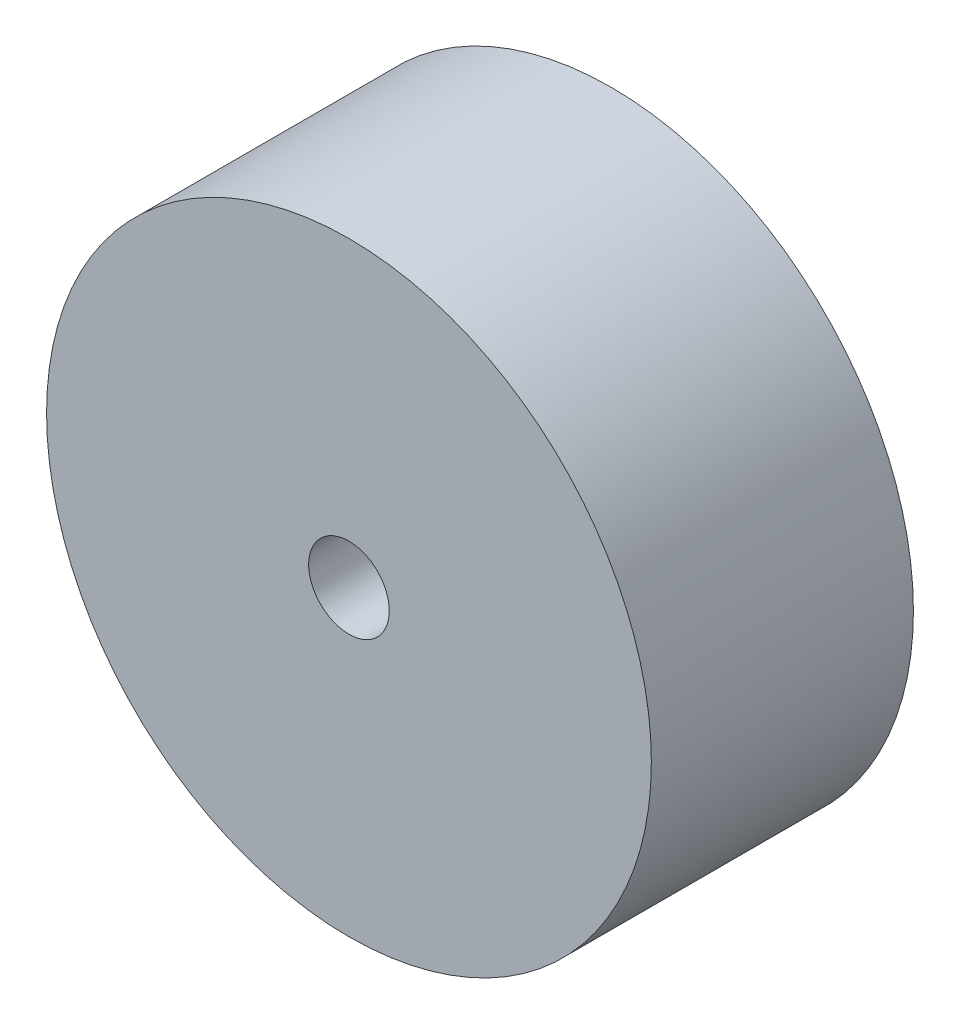
ISO-10303-21;
HEADER;
FILE_DESCRIPTION(('STEP AP214'),'2;1');
FILE_NAME('part.step','',(''),(''),'','','');
FILE_SCHEMA(('AUTOMOTIVE_DESIGN { 1 0 10303 214 1 1 1 1 }'));
ENDSEC;
DATA;
#1=APPLICATION_CONTEXT('core data for automotive mechanical design processes');
#2=APPLICATION_PROTOCOL_DEFINITION('international standard','automotive_design',2000,#1);
#3=PRODUCT_CONTEXT('',#1,'mechanical');
#4=PRODUCT('Part','Part','',(#3));
#5=PRODUCT_RELATED_PRODUCT_CATEGORY('part','',(#4));
#6=PRODUCT_DEFINITION_FORMATION('','',#4);
#7=PRODUCT_DEFINITION_CONTEXT('part definition',#1,'design');
#8=PRODUCT_DEFINITION('design','',#6,#7);
#9=PRODUCT_DEFINITION_SHAPE('','',#8);
#10=(LENGTH_UNIT() NAMED_UNIT(*) SI_UNIT(.MILLI.,.METRE.));
#11=(NAMED_UNIT(*) PLANE_ANGLE_UNIT() SI_UNIT($,.RADIAN.));
#12=(NAMED_UNIT(*) SI_UNIT($,.STERADIAN.) SOLID_ANGLE_UNIT());
#13=UNCERTAINTY_MEASURE_WITH_UNIT(LENGTH_MEASURE(1.E-05),#10,'distance_accuracy_value','');
#14=(GEOMETRIC_REPRESENTATION_CONTEXT(3) GLOBAL_UNCERTAINTY_ASSIGNED_CONTEXT((#13)) GLOBAL_UNIT_ASSIGNED_CONTEXT((#10,
#11,#12)) REPRESENTATION_CONTEXT('',''));
#15=CARTESIAN_POINT('',(0.,0.,0.));
#16=DIRECTION('',(0.,0.,1.));
#17=DIRECTION('',(1.,0.,0.));
#18=AXIS2_PLACEMENT_3D('',#15,#16,#17);
#19=CARTESIAN_POINT('',(0.,0.,26.));
#20=DIRECTION('',(0.,0.,-1.));
#21=DIRECTION('',(-1.,0.,0.));
#22=AXIS2_PLACEMENT_3D('',#19,#20,#21);
#23=CYLINDRICAL_SURFACE('',#22,30.);
#24=CARTESIAN_POINT('',(0.,0.,26.));
#25=DIRECTION('',(0.,0.,1.));
#26=DIRECTION('',(1.,0.,0.));
#27=AXIS2_PLACEMENT_3D('',#24,#25,#26);
#28=CIRCLE('',#27,30.);
#29=CARTESIAN_POINT('',(-30.,0.,26.));
#30=VERTEX_POINT('',#29);
#31=EDGE_CURVE('E10',#30,#30,#28,.T.);
#32=CARTESIAN_POINT('',(0.,0.,0.));
#33=DIRECTION('',(0.,0.,1.));
#34=DIRECTION('',(1.,0.,0.));
#35=AXIS2_PLACEMENT_3D('',#32,#33,#34);
#36=CIRCLE('',#35,30.);
#37=CARTESIAN_POINT('',(-30.,0.,0.));
#38=VERTEX_POINT('',#37);
#39=EDGE_CURVE('E34',#38,#38,#36,.T.);
#40=CARTESIAN_POINT('',(-30.,0.,26.));
#41=CARTESIAN_POINT('',(-30.,0.,25.7291666666667));
#42=CARTESIAN_POINT('',(-30.,0.,25.4583333333333));
#43=CARTESIAN_POINT('',(-30.,0.,24.9166666666667));
#44=CARTESIAN_POINT('',(-30.,0.,24.6458333333333));
#45=CARTESIAN_POINT('',(-30.,0.,24.1041666666667));
#46=CARTESIAN_POINT('',(-30.,0.,23.8333333333333));
#47=CARTESIAN_POINT('',(-30.,0.,23.2916666666667));
#48=CARTESIAN_POINT('',(-30.,0.,23.0208333333333));
#49=CARTESIAN_POINT('',(-30.,0.,22.4791666666667));
#50=CARTESIAN_POINT('',(-30.,0.,22.2083333333333));
#51=CARTESIAN_POINT('',(-30.,0.,21.6666666666667));
#52=CARTESIAN_POINT('',(-30.,0.,21.3958333333333));
#53=CARTESIAN_POINT('',(-30.,0.,20.8541666666667));
#54=CARTESIAN_POINT('',(-30.,0.,20.5833333333333));
#55=CARTESIAN_POINT('',(-30.,0.,20.0416666666667));
#56=CARTESIAN_POINT('',(-30.,0.,19.7708333333333));
#57=CARTESIAN_POINT('',(-30.,0.,19.2291666666667));
#58=CARTESIAN_POINT('',(-30.,0.,18.9583333333333));
#59=CARTESIAN_POINT('',(-30.,0.,18.4166666666667));
#60=CARTESIAN_POINT('',(-30.,0.,18.1458333333333));
#61=CARTESIAN_POINT('',(-30.,0.,17.6041666666667));
#62=CARTESIAN_POINT('',(-30.,0.,17.3333333333333));
#63=CARTESIAN_POINT('',(-30.,0.,16.7916666666667));
#64=CARTESIAN_POINT('',(-30.,0.,16.5208333333333));
#65=CARTESIAN_POINT('',(-30.,0.,15.9791666666667));
#66=CARTESIAN_POINT('',(-30.,0.,15.7083333333333));
#67=CARTESIAN_POINT('',(-30.,0.,15.1666666666667));
#68=CARTESIAN_POINT('',(-30.,0.,14.8958333333333));
#69=CARTESIAN_POINT('',(-30.,0.,14.3541666666667));
#70=CARTESIAN_POINT('',(-30.,0.,14.0833333333333));
#71=CARTESIAN_POINT('',(-30.,0.,13.5416666666667));
#72=CARTESIAN_POINT('',(-30.,0.,13.2708333333333));
#73=CARTESIAN_POINT('',(-30.,0.,12.7291666666667));
#74=CARTESIAN_POINT('',(-30.,0.,12.4583333333333));
#75=CARTESIAN_POINT('',(-30.,0.,11.9166666666667));
#76=CARTESIAN_POINT('',(-30.,0.,11.6458333333333));
#77=CARTESIAN_POINT('',(-30.,0.,11.1041666666667));
#78=CARTESIAN_POINT('',(-30.,0.,10.8333333333333));
#79=CARTESIAN_POINT('',(-30.,0.,10.2916666666667));
#80=CARTESIAN_POINT('',(-30.,0.,10.0208333333333));
#81=CARTESIAN_POINT('',(-30.,0.,9.47916666666667));
#82=CARTESIAN_POINT('',(-30.,0.,9.20833333333333));
#83=CARTESIAN_POINT('',(-30.,0.,8.66666666666667));
#84=CARTESIAN_POINT('',(-30.,0.,8.39583333333333));
#85=CARTESIAN_POINT('',(-30.,0.,7.85416666666667));
#86=CARTESIAN_POINT('',(-30.,0.,7.58333333333333));
#87=CARTESIAN_POINT('',(-30.,0.,7.04166666666667));
#88=CARTESIAN_POINT('',(-30.,0.,6.77083333333333));
#89=CARTESIAN_POINT('',(-30.,0.,6.22916666666667));
#90=CARTESIAN_POINT('',(-30.,0.,5.95833333333333));
#91=CARTESIAN_POINT('',(-30.,0.,5.41666666666667));
#92=CARTESIAN_POINT('',(-30.,0.,5.14583333333333));
#93=CARTESIAN_POINT('',(-30.,0.,4.60416666666667));
#94=CARTESIAN_POINT('',(-30.,0.,4.33333333333333));
#95=CARTESIAN_POINT('',(-30.,0.,3.79166666666667));
#96=CARTESIAN_POINT('',(-30.,0.,3.52083333333333));
#97=CARTESIAN_POINT('',(-30.,0.,2.97916666666667));
#98=CARTESIAN_POINT('',(-30.,0.,2.70833333333333));
#99=CARTESIAN_POINT('',(-30.,0.,2.16666666666667));
#100=CARTESIAN_POINT('',(-30.,0.,1.89583333333333));
#101=CARTESIAN_POINT('',(-30.,0.,1.35416666666667));
#102=CARTESIAN_POINT('',(-30.,0.,1.08333333333333));
#103=CARTESIAN_POINT('',(-30.,0.,0.541666666666667));
#104=CARTESIAN_POINT('',(-30.,0.,0.270833333333334));
#105=CARTESIAN_POINT('',(-30.,0.,0.));
#106=B_SPLINE_CURVE_WITH_KNOTS('',3,(#40,#41,#42,#43,#44,#45,#46,#47,#48,#49,#50,#51,#52,#53,
#54,#55,#56,#57,#58,#59,#60,#61,#62,#63,#64,#65,#66,#67,#68,#69,#70,#71,#72,#73,#74,#75,#76,#77,
#78,#79,#80,#81,#82,#83,#84,#85,#86,#87,#88,#89,#90,#91,#92,#93,#94,#95,#96,#97,#98,#99,#100,
#101,#102,#103,#104,#105),.UNSPECIFIED.,.F.,.F.,(4,2,2,2,2,2,2,2,2,2,2,2,2,2,2,2,2,2,2,2,2,2,2,
2,2,2,2,2,2,2,2,2,4),(0.,0.812500000000001,1.625,2.4375,3.25,4.0625,4.875,5.6875,6.5,7.3125,
8.125,8.9375,9.75,10.5625,11.375,12.1875,13.,13.8125,14.625,15.4375,16.25,17.0625,17.875,
18.6875,19.5,20.3125,21.125,21.9375,22.75,23.5625,24.375,25.1875,26.),.UNSPECIFIED.);
#107=EDGE_CURVE('BSEAM31',#30,#38,#106,.T.);
#108=ORIENTED_EDGE('',*,*,#31,.F.);
#109=ORIENTED_EDGE('',*,*,#39,.T.);
#110=ORIENTED_EDGE('',*,*,#107,.T.);
#111=ORIENTED_EDGE('',*,*,#107,.F.);
#112=EDGE_LOOP('',(#108,#110,#109,#111));
#113=FACE_BOUND('',#112,.T.);
#114=ADVANCED_FACE('F31',(#113),#23,.T.);
#115=CARTESIAN_POINT('',(0.,0.,26.));
#116=DIRECTION('',(0.,0.,1.));
#117=DIRECTION('',(1.,0.,0.));
#118=AXIS2_PLACEMENT_3D('',#115,#116,#117);
#119=PLANE('',#118);
#120=CARTESIAN_POINT('',(0.,0.,26.));
#121=DIRECTION('',(0.,0.,1.));
#122=DIRECTION('',(1.,0.,0.));
#123=AXIS2_PLACEMENT_3D('',#120,#121,#122);
#124=CIRCLE('',#123,4.);
#125=CARTESIAN_POINT('',(4.,0.,26.));
#126=VERTEX_POINT('',#125);
#127=EDGE_CURVE('E43',#126,#126,#124,.T.);
#128=ORIENTED_EDGE('',*,*,#127,.F.);
#129=EDGE_LOOP('',(#128));
#130=FACE_BOUND('',#129,.T.);
#131=ORIENTED_EDGE('',*,*,#31,.T.);
#132=EDGE_LOOP('',(#131));
#133=FACE_BOUND('',#132,.T.);
#134=ADVANCED_FACE('F58',(#130,#133),#119,.T.);
#135=CARTESIAN_POINT('',(0.,0.,0.));
#136=DIRECTION('',(0.,0.,1.));
#137=DIRECTION('',(1.,0.,0.));
#138=AXIS2_PLACEMENT_3D('',#135,#136,#137);
#139=PLANE('',#138);
#140=ORIENTED_EDGE('',*,*,#39,.F.);
#141=EDGE_LOOP('',(#140));
#142=FACE_BOUND('',#141,.T.);
#143=ADVANCED_FACE('F54',(#142),#139,.F.);
#144=CARTESIAN_POINT('',(0.,0.,16.));
#145=DIRECTION('',(0.,0.,1.));
#146=DIRECTION('',(1.,0.,0.));
#147=AXIS2_PLACEMENT_3D('',#144,#145,#146);
#148=CYLINDRICAL_SURFACE('',#147,4.);
#149=CARTESIAN_POINT('',(0.,0.,16.));
#150=DIRECTION('',(0.,0.,1.));
#151=DIRECTION('',(1.,0.,0.));
#152=AXIS2_PLACEMENT_3D('',#149,#150,#151);
#153=CIRCLE('',#152,4.);
#154=CARTESIAN_POINT('',(4.,0.,16.));
#155=VERTEX_POINT('',#154);
#156=EDGE_CURVE('E41',#155,#155,#153,.T.);
#157=ORIENTED_EDGE('',*,*,#156,.F.);
#158=EDGE_LOOP('',(#157));
#159=FACE_BOUND('',#158,.T.);
#160=ORIENTED_EDGE('',*,*,#127,.T.);
#161=EDGE_LOOP('',(#160));
#162=FACE_BOUND('',#161,.T.);
#163=ADVANCED_FACE('F51',(#159,#162),#148,.F.);
#164=CARTESIAN_POINT('',(0.,0.,16.));
#165=DIRECTION('',(0.,0.,1.));
#166=DIRECTION('',(1.,0.,0.));
#167=AXIS2_PLACEMENT_3D('',#164,#165,#166);
#168=PLANE('',#167);
#169=ORIENTED_EDGE('',*,*,#156,.T.);
#170=EDGE_LOOP('',(#169));
#171=FACE_BOUND('',#170,.T.);
#172=ADVANCED_FACE('F49',(#171),#168,.T.);
#173=CLOSED_SHELL('',(#114,#134,#143,#163,#172));
#174=MANIFOLD_SOLID_BREP('B2',#173);
#175=ADVANCED_BREP_SHAPE_REPRESENTATION('',(#18,#174),#14);
#176=SHAPE_DEFINITION_REPRESENTATION(#9,#175);
ENDSEC;
END-ISO-10303-21;
